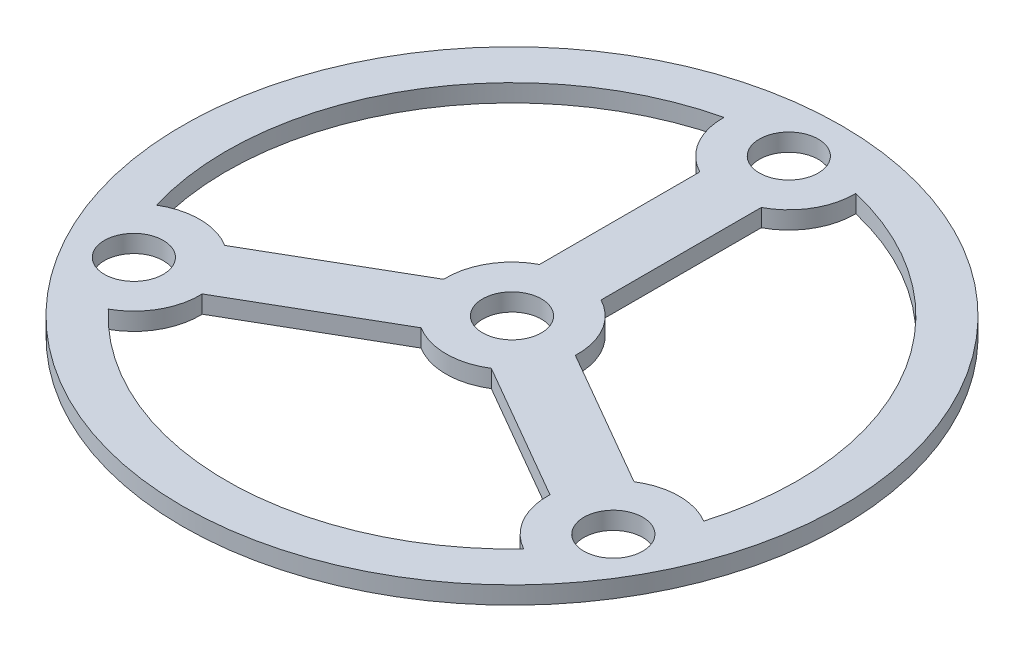
ISO-10303-21;
HEADER;
FILE_DESCRIPTION(('STEP AP214'),'2;1');
FILE_NAME('part.step','',(''),(''),'','','');
FILE_SCHEMA(('AUTOMOTIVE_DESIGN { 1 0 10303 214 1 1 1 1 }'));
ENDSEC;
DATA;
#1=APPLICATION_CONTEXT('core data for automotive mechanical design processes');
#2=APPLICATION_PROTOCOL_DEFINITION('international standard','automotive_design',2000,#1);
#3=PRODUCT_CONTEXT('',#1,'mechanical');
#4=PRODUCT('Part','Part','',(#3));
#5=PRODUCT_RELATED_PRODUCT_CATEGORY('part','',(#4));
#6=PRODUCT_DEFINITION_FORMATION('','',#4);
#7=PRODUCT_DEFINITION_CONTEXT('part definition',#1,'design');
#8=PRODUCT_DEFINITION('design','',#6,#7);
#9=PRODUCT_DEFINITION_SHAPE('','',#8);
#10=(LENGTH_UNIT() NAMED_UNIT(*) SI_UNIT(.MILLI.,.METRE.));
#11=(NAMED_UNIT(*) PLANE_ANGLE_UNIT() SI_UNIT($,.RADIAN.));
#12=(NAMED_UNIT(*) SI_UNIT($,.STERADIAN.) SOLID_ANGLE_UNIT());
#13=UNCERTAINTY_MEASURE_WITH_UNIT(LENGTH_MEASURE(1.E-05),#10,'distance_accuracy_value','');
#14=(GEOMETRIC_REPRESENTATION_CONTEXT(3) GLOBAL_UNCERTAINTY_ASSIGNED_CONTEXT((#13)) GLOBAL_UNIT_ASSIGNED_CONTEXT((#10,
#11,#12)) REPRESENTATION_CONTEXT('',''));
#15=CARTESIAN_POINT('',(0.,0.,0.));
#16=DIRECTION('',(0.,0.,1.));
#17=DIRECTION('',(1.,0.,0.));
#18=AXIS2_PLACEMENT_3D('',#15,#16,#17);
#19=CARTESIAN_POINT('',(0.,2.,-31.5));
#20=DIRECTION('',(0.,-1.,0.));
#21=DIRECTION('',(0.,0.,-1.));
#22=AXIS2_PLACEMENT_3D('',#19,#20,#21);
#23=CYLINDRICAL_SURFACE('',#22,7.50000000000002);
#24=CARTESIAN_POINT('',(0.,2.,-31.5));
#25=DIRECTION('',(0.,-1.,0.));
#26=DIRECTION('',(0.,0.,1.));
#27=AXIS2_PLACEMENT_3D('',#24,#25,#26);
#28=CIRCLE('',#27,7.50000000000002);
#29=CARTESIAN_POINT('',(7.49899107180287,2.,-31.623015873016));
#30=VERTEX_POINT('',#29);
#31=CARTESIAN_POINT('',(3.49999999999925,2.,-24.8667504192888));
#32=VERTEX_POINT('',#31);
#33=EDGE_CURVE('E251',#30,#32,#28,.T.);
#34=ORIENTED_EDGE('',*,*,#33,.T.);
#35=DIRECTION('',(0.,-1.,0.));
#36=VECTOR('',#35,1.);
#37=CARTESIAN_POINT('',(3.49999999999925,2.,-24.8667504192888));
#38=LINE('',#37,#36);
#39=CARTESIAN_POINT('',(3.49999999999925,0.,-24.8667504192888));
#40=VERTEX_POINT('',#39);
#41=EDGE_CURVE('E11',#32,#40,#38,.T.);
#42=ORIENTED_EDGE('',*,*,#41,.T.);
#43=CARTESIAN_POINT('',(0.,0.,-31.5));
#44=DIRECTION('',(0.,-1.,0.));
#45=DIRECTION('',(0.,0.,1.));
#46=AXIS2_PLACEMENT_3D('',#43,#44,#45);
#47=CIRCLE('',#46,7.50000000000002);
#48=CARTESIAN_POINT('',(7.49899107180287,0.,-31.623015873016));
#49=VERTEX_POINT('',#48);
#50=EDGE_CURVE('E269',#49,#40,#47,.T.);
#51=ORIENTED_EDGE('',*,*,#50,.F.);
#52=DIRECTION('',(0.,-1.,0.));
#53=VECTOR('',#52,1.);
#54=CARTESIAN_POINT('',(7.49899107180287,2.,-31.623015873016));
#55=LINE('',#54,#53);
#56=EDGE_CURVE('E268',#30,#49,#55,.T.);
#57=ORIENTED_EDGE('',*,*,#56,.F.);
#58=EDGE_LOOP('',(#34,#42,#51,#57));
#59=FACE_BOUND('',#58,.T.);
#60=ADVANCED_FACE('F35',(#59),#23,.T.);
#61=CARTESIAN_POINT('',(-27.2798002192094,2.,15.7500000000008));
#62=DIRECTION('',(0.,-1.,0.));
#63=DIRECTION('',(0.,0.,-1.));
#64=AXIS2_PLACEMENT_3D('',#61,#62,#63);
#65=CYLINDRICAL_SURFACE('',#64,7.50000000000002);
#66=CARTESIAN_POINT('',(-27.2798002192094,2.,15.7500000000008));
#67=DIRECTION('',(0.,-1.,0.));
#68=DIRECTION('',(0.,0.,1.));
#69=AXIS2_PLACEMENT_3D('',#66,#67,#68);
#70=CIRCLE('',#69,7.50000000000002);
#71=CARTESIAN_POINT('',(-31.1358306262119,2.,9.31719116557405));
#72=VERTEX_POINT('',#71);
#73=CARTESIAN_POINT('',(-23.2852375726713,2.,9.4022862963998));
#74=VERTEX_POINT('',#73);
#75=EDGE_CURVE('E258',#72,#74,#70,.T.);
#76=ORIENTED_EDGE('',*,*,#75,.T.);
#77=DIRECTION('',(0.,-1.,0.));
#78=VECTOR('',#77,1.);
#79=CARTESIAN_POINT('',(-23.2852375726713,2.,9.4022862963998));
#80=LINE('',#79,#78);
#81=CARTESIAN_POINT('',(-23.2852375726713,0.,9.4022862963998));
#82=VERTEX_POINT('',#81);
#83=EDGE_CURVE('E317',#74,#82,#80,.T.);
#84=ORIENTED_EDGE('',*,*,#83,.T.);
#85=CARTESIAN_POINT('',(-27.2798002192094,0.,15.7500000000008));
#86=DIRECTION('',(0.,-1.,0.));
#87=DIRECTION('',(0.,0.,1.));
#88=AXIS2_PLACEMENT_3D('',#85,#86,#87);
#89=CIRCLE('',#88,7.50000000000002);
#90=CARTESIAN_POINT('',(-31.1358306262119,0.,9.31719116557405));
#91=VERTEX_POINT('',#90);
#92=EDGE_CURVE('E276',#91,#82,#89,.T.);
#93=ORIENTED_EDGE('',*,*,#92,.F.);
#94=DIRECTION('',(0.,-1.,0.));
#95=VECTOR('',#94,1.);
#96=CARTESIAN_POINT('',(-31.1358306262119,2.,9.31719116557405));
#97=LINE('',#96,#95);
#98=EDGE_CURVE('E299',#72,#91,#97,.T.);
#99=ORIENTED_EDGE('',*,*,#98,.F.);
#100=EDGE_LOOP('',(#76,#84,#93,#99));
#101=FACE_BOUND('',#100,.T.);
#102=ADVANCED_FACE('F338',(#101),#65,.T.);
#103=CARTESIAN_POINT('',(27.2798002192103,2.,15.7499999999993));
#104=DIRECTION('',(0.,-1.,0.));
#105=DIRECTION('',(0.,0.,-1.));
#106=AXIS2_PLACEMENT_3D('',#103,#104,#105);
#107=CYLINDRICAL_SURFACE('',#106,7.49999999999999);
#108=CARTESIAN_POINT('',(27.2798002192103,2.,15.7499999999993));
#109=DIRECTION('',(0.,-1.,0.));
#110=DIRECTION('',(0.,0.,1.));
#111=AXIS2_PLACEMENT_3D('',#108,#109,#110);
#112=CIRCLE('',#111,7.49999999999999);
#113=CARTESIAN_POINT('',(23.636839554409,2.,22.305824707442));
#114=VERTEX_POINT('',#113);
#115=CARTESIAN_POINT('',(19.7852375726722,2.,15.4644641228897));
#116=VERTEX_POINT('',#115);
#117=EDGE_CURVE('E263',#114,#116,#112,.T.);
#118=ORIENTED_EDGE('',*,*,#117,.T.);
#119=DIRECTION('',(0.,-1.,0.));
#120=VECTOR('',#119,1.);
#121=CARTESIAN_POINT('',(19.7852375726722,2.,15.4644641228897));
#122=LINE('',#121,#120);
#123=CARTESIAN_POINT('',(19.7852375726722,0.,15.4644641228897));
#124=VERTEX_POINT('',#123);
#125=EDGE_CURVE('E308',#116,#124,#122,.T.);
#126=ORIENTED_EDGE('',*,*,#125,.T.);
#127=CARTESIAN_POINT('',(27.2798002192103,0.,15.7499999999993));
#128=DIRECTION('',(0.,-1.,0.));
#129=DIRECTION('',(0.,0.,1.));
#130=AXIS2_PLACEMENT_3D('',#127,#128,#129);
#131=CIRCLE('',#130,7.49999999999999);
#132=CARTESIAN_POINT('',(23.636839554409,0.,22.305824707442));
#133=VERTEX_POINT('',#132);
#134=EDGE_CURVE('E283',#133,#124,#131,.T.);
#135=ORIENTED_EDGE('',*,*,#134,.F.);
#136=DIRECTION('',(0.,-1.,0.));
#137=VECTOR('',#136,1.);
#138=CARTESIAN_POINT('',(23.636839554409,2.,22.305824707442));
#139=LINE('',#138,#137);
#140=EDGE_CURVE('E294',#114,#133,#139,.T.);
#141=ORIENTED_EDGE('',*,*,#140,.F.);
#142=EDGE_LOOP('',(#118,#126,#135,#141));
#143=FACE_BOUND('',#142,.T.);
#144=ADVANCED_FACE('F360',(#143),#107,.T.);
#145=CARTESIAN_POINT('',(0.,2.,0.));
#146=DIRECTION('',(0.,1.,0.));
#147=DIRECTION('',(0.,0.,1.));
#148=AXIS2_PLACEMENT_3D('',#145,#146,#147);
#149=PLANE('',#148);
#150=CARTESIAN_POINT('',(27.2798002192103,2.,15.7499999999993));
#151=DIRECTION('',(0.,1.,0.));
#152=DIRECTION('',(0.,0.,1.));
#153=AXIS2_PLACEMENT_3D('',#150,#151,#152);
#154=CIRCLE('',#153,3.35000000000095);
#155=CARTESIAN_POINT('',(27.2798002192103,2.,19.1000000000002));
#156=VERTEX_POINT('',#155);
#157=EDGE_CURVE('E239',#156,#156,#154,.T.);
#158=ORIENTED_EDGE('',*,*,#157,.F.);
#159=EDGE_LOOP('',(#158));
#160=FACE_BOUND('',#159,.T.);
#161=CARTESIAN_POINT('',(23.285237572672,2.,9.40228629639847));
#162=VERTEX_POINT('',#161);
#163=CARTESIAN_POINT('',(31.1358306262122,2.,9.31719116557278));
#164=VERTEX_POINT('',#163);
#165=EDGE_CURVE('E189',#162,#164,#112,.T.);
#166=ORIENTED_EDGE('',*,*,#165,.F.);
#167=DIRECTION('',(0.866025403784434,0.,0.500000000000008));
#168=VECTOR('',#167,1.);
#169=CARTESIAN_POINT('',(1.75000000000046,2.,-3.03108891324628));
#170=LINE('',#169,#168);
#171=CARTESIAN_POINT('',(7.49456264653806,2.,0.285535877108947));
#172=VERTEX_POINT('',#171);
#173=EDGE_CURVE('E166',#172,#162,#170,.T.);
#174=ORIENTED_EDGE('',*,*,#173,.F.);
#175=CARTESIAN_POINT('',(0.,2.,0.));
#176=DIRECTION('',(0.,1.,0.));
#177=DIRECTION('',(0.,0.,1.));
#178=AXIS2_PLACEMENT_3D('',#175,#176,#177);
#179=CIRCLE('',#178,7.5);
#180=CARTESIAN_POINT('',(3.49999999999916,2.,-6.63324958071124));
#181=VERTEX_POINT('',#180);
#182=EDGE_CURVE('E175',#172,#181,#179,.T.);
#183=ORIENTED_EDGE('',*,*,#182,.T.);
#184=DIRECTION('',(0.,0.,-1.));
#185=VECTOR('',#184,1.);
#186=CARTESIAN_POINT('',(3.49999999999913,2.,0.));
#187=LINE('',#186,#185);
#188=EDGE_CURVE('E181',#181,#32,#187,.T.);
#189=ORIENTED_EDGE('',*,*,#188,.T.);
#190=ORIENTED_EDGE('',*,*,#33,.F.);
#191=CARTESIAN_POINT('',(0.,2.,0.));
#192=DIRECTION('',(0.,1.,0.));
#193=DIRECTION('',(0.,0.,1.));
#194=AXIS2_PLACEMENT_3D('',#191,#192,#193);
#195=CIRCLE('',#194,32.5000000000001);
#196=EDGE_CURVE('E266',#164,#30,#195,.T.);
#197=ORIENTED_EDGE('',*,*,#196,.F.);
#198=EDGE_LOOP('',(#166,#174,#183,#189,#190,#197));
#199=FACE_BOUND('',#198,.T.);
#200=CARTESIAN_POINT('',(0.,2.,-31.5));
#201=DIRECTION('',(0.,1.,0.));
#202=DIRECTION('',(0.,0.,1.));
#203=AXIS2_PLACEMENT_3D('',#200,#201,#202);
#204=CIRCLE('',#203,3.35);
#205=CARTESIAN_POINT('',(0.,2.,-28.15));
#206=VERTEX_POINT('',#205);
#207=EDGE_CURVE('E245',#206,#206,#204,.T.);
#208=ORIENTED_EDGE('',*,*,#207,.F.);
#209=EDGE_LOOP('',(#208));
#210=FACE_BOUND('',#209,.T.);
#211=CARTESIAN_POINT('',(-3.50000000000076,2.,-24.8667504192896));
#212=VERTEX_POINT('',#211);
#213=CARTESIAN_POINT('',(-7.49899107180383,2.,-31.6230158730158));
#214=VERTEX_POINT('',#213);
#215=EDGE_CURVE('E255',#212,#214,#28,.T.);
#216=ORIENTED_EDGE('',*,*,#215,.F.);
#217=DIRECTION('',(0.,0.,-1.));
#218=VECTOR('',#217,1.);
#219=CARTESIAN_POINT('',(-3.50000000000087,2.,0.));
#220=LINE('',#219,#218);
#221=CARTESIAN_POINT('',(-3.50000000000084,2.,-6.63324958071036));
#222=VERTEX_POINT('',#221);
#223=EDGE_CURVE('E197',#222,#212,#220,.T.);
#224=ORIENTED_EDGE('',*,*,#223,.F.);
#225=CARTESIAN_POINT('',(-7.49456264653799,2.,0.285535877110846));
#226=VERTEX_POINT('',#225);
#227=EDGE_CURVE('E184',#222,#226,#179,.T.);
#228=ORIENTED_EDGE('',*,*,#227,.T.);
#229=DIRECTION('',(-0.866025403784439,0.,0.5));
#230=VECTOR('',#229,1.);
#231=CARTESIAN_POINT('',(-1.74999999999957,2.,-3.03108891324478));
#232=LINE('',#231,#230);
#233=EDGE_CURVE('E199',#226,#74,#232,.T.);
#234=ORIENTED_EDGE('',*,*,#233,.T.);
#235=ORIENTED_EDGE('',*,*,#75,.F.);
#236=CARTESIAN_POINT('',(0.,2.,0.));
#237=DIRECTION('',(0.,1.,0.));
#238=DIRECTION('',(0.,0.,1.));
#239=AXIS2_PLACEMENT_3D('',#236,#237,#238);
#240=CIRCLE('',#239,32.5000000000001);
#241=EDGE_CURVE('E254',#214,#72,#240,.T.);
#242=ORIENTED_EDGE('',*,*,#241,.F.);
#243=EDGE_LOOP('',(#216,#224,#228,#234,#235,#242));
#244=FACE_BOUND('',#243,.T.);
#245=CARTESIAN_POINT('',(-27.2798002192094,2.,15.7500000000008));
#246=DIRECTION('',(0.,1.,0.));
#247=DIRECTION('',(0.,0.,1.));
#248=AXIS2_PLACEMENT_3D('',#245,#246,#247);
#249=CIRCLE('',#248,3.35000000000111);
#250=CARTESIAN_POINT('',(-27.2798002192094,2.,19.1000000000019));
#251=VERTEX_POINT('',#250);
#252=EDGE_CURVE('E233',#251,#251,#249,.T.);
#253=ORIENTED_EDGE('',*,*,#252,.F.);
#254=EDGE_LOOP('',(#253));
#255=FACE_BOUND('',#254,.T.);
#256=CARTESIAN_POINT('',(-19.7852375726713,2.,15.4644641228909));
#257=VERTEX_POINT('',#256);
#258=CARTESIAN_POINT('',(-23.6368395544081,2.,22.3058247074431));
#259=VERTEX_POINT('',#258);
#260=EDGE_CURVE('E257',#257,#259,#70,.T.);
#261=ORIENTED_EDGE('',*,*,#260,.F.);
#262=DIRECTION('',(-0.866025403784439,0.,0.5));
#263=VECTOR('',#262,1.);
#264=CARTESIAN_POINT('',(1.75000000000044,2.,3.03108891324629));
#265=LINE('',#264,#263);
#266=CARTESIAN_POINT('',(-3.99456264653719,2.,6.34771370360146));
#267=VERTEX_POINT('',#266);
#268=EDGE_CURVE('E202',#267,#257,#265,.T.);
#269=ORIENTED_EDGE('',*,*,#268,.F.);
#270=CARTESIAN_POINT('',(3.9945626465388,2.,6.34771370360045));
#271=VERTEX_POINT('',#270);
#272=EDGE_CURVE('E183',#267,#271,#179,.T.);
#273=ORIENTED_EDGE('',*,*,#272,.T.);
#274=DIRECTION('',(0.866025403784434,0.,0.500000000000008));
#275=VECTOR('',#274,1.);
#276=CARTESIAN_POINT('',(-1.74999999999959,2.,3.03108891324476));
#277=LINE('',#276,#275);
#278=EDGE_CURVE('E204',#271,#116,#277,.T.);
#279=ORIENTED_EDGE('',*,*,#278,.T.);
#280=ORIENTED_EDGE('',*,*,#117,.F.);
#281=CARTESIAN_POINT('',(0.,2.,0.));
#282=DIRECTION('',(0.,1.,0.));
#283=DIRECTION('',(0.,0.,1.));
#284=AXIS2_PLACEMENT_3D('',#281,#282,#283);
#285=CIRCLE('',#284,32.5000000000001);
#286=EDGE_CURVE('E261',#259,#114,#285,.T.);
#287=ORIENTED_EDGE('',*,*,#286,.F.);
#288=EDGE_LOOP('',(#261,#269,#273,#279,#280,#287));
#289=FACE_BOUND('',#288,.T.);
#290=CARTESIAN_POINT('',(0.,2.,0.));
#291=DIRECTION('',(0.,1.,0.));
#292=DIRECTION('',(0.,0.,1.));
#293=AXIS2_PLACEMENT_3D('',#290,#291,#292);
#294=CIRCLE('',#293,3.35);
#295=CARTESIAN_POINT('',(0.,2.,3.35));
#296=VERTEX_POINT('',#295);
#297=EDGE_CURVE('E207',#296,#296,#294,.T.);
#298=ORIENTED_EDGE('',*,*,#297,.F.);
#299=EDGE_LOOP('',(#298));
#300=FACE_BOUND('',#299,.T.);
#301=CARTESIAN_POINT('',(0.,2.,0.));
#302=DIRECTION('',(0.,1.,0.));
#303=DIRECTION('',(0.,0.,1.));
#304=AXIS2_PLACEMENT_3D('',#301,#302,#303);
#305=CIRCLE('',#304,37.5);
#306=CARTESIAN_POINT('',(0.,2.,37.5));
#307=VERTEX_POINT('',#306);
#308=EDGE_CURVE('E305',#307,#307,#305,.T.);
#309=ORIENTED_EDGE('',*,*,#308,.T.);
#310=EDGE_LOOP('',(#309));
#311=FACE_BOUND('',#310,.T.);
#312=ADVANCED_FACE('F186',(#160,#199,#210,#244,#255,#289,#300,#311),#149,.T.);
#313=CARTESIAN_POINT('',(0.,0.,0.));
#314=DIRECTION('',(0.,1.,0.));
#315=DIRECTION('',(0.,0.,1.));
#316=AXIS2_PLACEMENT_3D('',#313,#314,#315);
#317=PLANE('',#316);
#318=CARTESIAN_POINT('',(27.2798002192103,0.,15.7499999999993));
#319=DIRECTION('',(0.,1.,0.));
#320=DIRECTION('',(0.,0.,1.));
#321=AXIS2_PLACEMENT_3D('',#318,#319,#320);
#322=CIRCLE('',#321,3.35000000000095);
#323=CARTESIAN_POINT('',(27.2798002192103,0.,19.1000000000002));
#324=VERTEX_POINT('',#323);
#325=EDGE_CURVE('E236',#324,#324,#322,.T.);
#326=ORIENTED_EDGE('',*,*,#325,.T.);
#327=EDGE_LOOP('',(#326));
#328=FACE_BOUND('',#327,.T.);
#329=DIRECTION('',(0.866025403784434,0.,0.500000000000008));
#330=VECTOR('',#329,1.);
#331=CARTESIAN_POINT('',(1.75000000000046,0.,-3.03108891324628));
#332=LINE('',#331,#330);
#333=CARTESIAN_POINT('',(7.49456264653806,0.,0.285535877108947));
#334=VERTEX_POINT('',#333);
#335=CARTESIAN_POINT('',(23.285237572672,0.,9.40228629639847));
#336=VERTEX_POINT('',#335);
#337=EDGE_CURVE('E168',#334,#336,#332,.T.);
#338=ORIENTED_EDGE('',*,*,#337,.T.);
#339=CARTESIAN_POINT('',(31.1358306262123,0.,9.3171911655728));
#340=VERTEX_POINT('',#339);
#341=EDGE_CURVE('E282',#336,#340,#131,.T.);
#342=ORIENTED_EDGE('',*,*,#341,.T.);
#343=CARTESIAN_POINT('',(0.,0.,0.));
#344=DIRECTION('',(0.,1.,0.));
#345=DIRECTION('',(0.,0.,1.));
#346=AXIS2_PLACEMENT_3D('',#343,#344,#345);
#347=CIRCLE('',#346,32.5000000000001);
#348=EDGE_CURVE('E286',#340,#49,#347,.T.);
#349=ORIENTED_EDGE('',*,*,#348,.T.);
#350=ORIENTED_EDGE('',*,*,#50,.T.);
#351=DIRECTION('',(0.,0.,-1.));
#352=VECTOR('',#351,1.);
#353=CARTESIAN_POINT('',(3.49999999999913,0.,0.));
#354=LINE('',#353,#352);
#355=CARTESIAN_POINT('',(3.49999999999916,0.,-6.63324958071124));
#356=VERTEX_POINT('',#355);
#357=EDGE_CURVE('E214',#356,#40,#354,.T.);
#358=ORIENTED_EDGE('',*,*,#357,.F.);
#359=CARTESIAN_POINT('',(0.,0.,0.));
#360=DIRECTION('',(0.,1.,0.));
#361=DIRECTION('',(0.,0.,1.));
#362=AXIS2_PLACEMENT_3D('',#359,#360,#361);
#363=CIRCLE('',#362,7.5);
#364=EDGE_CURVE('E212',#334,#356,#363,.T.);
#365=ORIENTED_EDGE('',*,*,#364,.F.);
#366=EDGE_LOOP('',(#338,#342,#349,#350,#358,#365));
#367=FACE_BOUND('',#366,.T.);
#368=CARTESIAN_POINT('',(0.,0.,-31.5));
#369=DIRECTION('',(0.,1.,0.));
#370=DIRECTION('',(0.,0.,1.));
#371=AXIS2_PLACEMENT_3D('',#368,#369,#370);
#372=CIRCLE('',#371,3.35);
#373=CARTESIAN_POINT('',(0.,0.,-28.15));
#374=VERTEX_POINT('',#373);
#375=EDGE_CURVE('E242',#374,#374,#372,.T.);
#376=ORIENTED_EDGE('',*,*,#375,.T.);
#377=EDGE_LOOP('',(#376));
#378=FACE_BOUND('',#377,.T.);
#379=DIRECTION('',(0.,0.,-1.));
#380=VECTOR('',#379,1.);
#381=CARTESIAN_POINT('',(-3.50000000000087,0.,0.));
#382=LINE('',#381,#380);
#383=CARTESIAN_POINT('',(-3.50000000000084,0.,-6.63324958071036));
#384=VERTEX_POINT('',#383);
#385=CARTESIAN_POINT('',(-3.50000000000076,0.,-24.8667504192896));
#386=VERTEX_POINT('',#385);
#387=EDGE_CURVE('E50',#384,#386,#382,.T.);
#388=ORIENTED_EDGE('',*,*,#387,.T.);
#389=CARTESIAN_POINT('',(-7.49899107180383,0.,-31.6230158730158));
#390=VERTEX_POINT('',#389);
#391=EDGE_CURVE('E248',#386,#390,#47,.T.);
#392=ORIENTED_EDGE('',*,*,#391,.T.);
#393=CARTESIAN_POINT('',(0.,0.,0.));
#394=DIRECTION('',(0.,1.,0.));
#395=DIRECTION('',(0.,0.,1.));
#396=AXIS2_PLACEMENT_3D('',#393,#394,#395);
#397=CIRCLE('',#396,32.5000000000001);
#398=EDGE_CURVE('E272',#390,#91,#397,.T.);
#399=ORIENTED_EDGE('',*,*,#398,.T.);
#400=ORIENTED_EDGE('',*,*,#92,.T.);
#401=DIRECTION('',(-0.866025403784439,0.,0.5));
#402=VECTOR('',#401,1.);
#403=CARTESIAN_POINT('',(-1.74999999999957,0.,-3.03108891324478));
#404=LINE('',#403,#402);
#405=CARTESIAN_POINT('',(-7.49456264653799,0.,0.285535877110846));
#406=VERTEX_POINT('',#405);
#407=EDGE_CURVE('E219',#406,#82,#404,.T.);
#408=ORIENTED_EDGE('',*,*,#407,.F.);
#409=EDGE_CURVE('E216',#384,#406,#363,.T.);
#410=ORIENTED_EDGE('',*,*,#409,.F.);
#411=EDGE_LOOP('',(#388,#392,#399,#400,#408,#410));
#412=FACE_BOUND('',#411,.T.);
#413=CARTESIAN_POINT('',(-27.2798002192094,0.,15.7500000000008));
#414=DIRECTION('',(0.,1.,0.));
#415=DIRECTION('',(0.,0.,1.));
#416=AXIS2_PLACEMENT_3D('',#413,#414,#415);
#417=CIRCLE('',#416,3.35000000000111);
#418=CARTESIAN_POINT('',(-27.2798002192094,0.,19.1000000000019));
#419=VERTEX_POINT('',#418);
#420=EDGE_CURVE('E171',#419,#419,#417,.T.);
#421=ORIENTED_EDGE('',*,*,#420,.T.);
#422=EDGE_LOOP('',(#421));
#423=FACE_BOUND('',#422,.T.);
#424=DIRECTION('',(-0.866025403784439,0.,0.5));
#425=VECTOR('',#424,1.);
#426=CARTESIAN_POINT('',(1.75000000000044,0.,3.03108891324629));
#427=LINE('',#426,#425);
#428=CARTESIAN_POINT('',(-3.99456264653719,0.,6.34771370360146));
#429=VERTEX_POINT('',#428);
#430=CARTESIAN_POINT('',(-19.7852375726713,0.,15.4644641228909));
#431=VERTEX_POINT('',#430);
#432=EDGE_CURVE('E58',#429,#431,#427,.T.);
#433=ORIENTED_EDGE('',*,*,#432,.T.);
#434=CARTESIAN_POINT('',(-23.6368395544081,0.,22.3058247074431));
#435=VERTEX_POINT('',#434);
#436=EDGE_CURVE('E275',#431,#435,#89,.T.);
#437=ORIENTED_EDGE('',*,*,#436,.T.);
#438=CARTESIAN_POINT('',(0.,0.,0.));
#439=DIRECTION('',(0.,1.,0.));
#440=DIRECTION('',(0.,0.,1.));
#441=AXIS2_PLACEMENT_3D('',#438,#439,#440);
#442=CIRCLE('',#441,32.5000000000001);
#443=EDGE_CURVE('E279',#435,#133,#442,.T.);
#444=ORIENTED_EDGE('',*,*,#443,.T.);
#445=ORIENTED_EDGE('',*,*,#134,.T.);
#446=DIRECTION('',(0.866025403784434,0.,0.500000000000008));
#447=VECTOR('',#446,1.);
#448=CARTESIAN_POINT('',(-1.74999999999959,0.,3.03108891324476));
#449=LINE('',#448,#447);
#450=CARTESIAN_POINT('',(3.9945626465388,0.,6.34771370360045));
#451=VERTEX_POINT('',#450);
#452=EDGE_CURVE('E193',#451,#124,#449,.T.);
#453=ORIENTED_EDGE('',*,*,#452,.F.);
#454=EDGE_CURVE('E215',#429,#451,#363,.T.);
#455=ORIENTED_EDGE('',*,*,#454,.F.);
#456=EDGE_LOOP('',(#433,#437,#444,#445,#453,#455));
#457=FACE_BOUND('',#456,.T.);
#458=CARTESIAN_POINT('',(0.,0.,0.));
#459=DIRECTION('',(0.,1.,0.));
#460=DIRECTION('',(0.,0.,1.));
#461=AXIS2_PLACEMENT_3D('',#458,#459,#460);
#462=CIRCLE('',#461,3.35);
#463=CARTESIAN_POINT('',(0.,0.,3.35));
#464=VERTEX_POINT('',#463);
#465=EDGE_CURVE('E190',#464,#464,#462,.T.);
#466=ORIENTED_EDGE('',*,*,#465,.T.);
#467=EDGE_LOOP('',(#466));
#468=FACE_BOUND('',#467,.T.);
#469=CARTESIAN_POINT('',(0.,0.,0.));
#470=DIRECTION('',(0.,1.,0.));
#471=DIRECTION('',(0.,0.,1.));
#472=AXIS2_PLACEMENT_3D('',#469,#470,#471);
#473=CIRCLE('',#472,37.5);
#474=CARTESIAN_POINT('',(0.,0.,37.5));
#475=VERTEX_POINT('',#474);
#476=EDGE_CURVE('E304',#475,#475,#473,.T.);
#477=ORIENTED_EDGE('',*,*,#476,.F.);
#478=EDGE_LOOP('',(#477));
#479=FACE_BOUND('',#478,.T.);
#480=ADVANCED_FACE('F329',(#328,#367,#378,#412,#423,#457,#468,#479),#317,.F.);
#481=CARTESIAN_POINT('',(0.,2.,0.));
#482=DIRECTION('',(0.,-1.,0.));
#483=DIRECTION('',(0.,0.,-1.));
#484=AXIS2_PLACEMENT_3D('',#481,#482,#483);
#485=CYLINDRICAL_SURFACE('',#484,37.5);
#486=ORIENTED_EDGE('',*,*,#308,.F.);
#487=EDGE_LOOP('',(#486));
#488=FACE_BOUND('',#487,.T.);
#489=ORIENTED_EDGE('',*,*,#476,.T.);
#490=EDGE_LOOP('',(#489));
#491=FACE_BOUND('',#490,.T.);
#492=ADVANCED_FACE('F37',(#488,#491),#485,.T.);
#493=DIRECTION('',(0.,-1.,0.));
#494=VECTOR('',#493,1.);
#495=CARTESIAN_POINT('',(-3.50000000000076,2.,-24.8667504192896));
#496=LINE('',#495,#494);
#497=EDGE_CURVE('E43',#212,#386,#496,.T.);
#498=ORIENTED_EDGE('',*,*,#497,.F.);
#499=ORIENTED_EDGE('',*,*,#215,.T.);
#500=DIRECTION('',(0.,-1.,0.));
#501=VECTOR('',#500,1.);
#502=CARTESIAN_POINT('',(-7.49899107180383,2.,-31.6230158730158));
#503=LINE('',#502,#501);
#504=EDGE_CURVE('E301',#214,#390,#503,.T.);
#505=ORIENTED_EDGE('',*,*,#504,.T.);
#506=ORIENTED_EDGE('',*,*,#391,.F.);
#507=EDGE_LOOP('',(#498,#499,#505,#506));
#508=FACE_BOUND('',#507,.T.);
#509=ADVANCED_FACE('F326',(#508),#23,.T.);
#510=CARTESIAN_POINT('',(0.,2.,0.));
#511=DIRECTION('',(0.,-1.,0.));
#512=DIRECTION('',(0.,0.,-1.));
#513=AXIS2_PLACEMENT_3D('',#510,#511,#512);
#514=CYLINDRICAL_SURFACE('',#513,32.5000000000001);
#515=ORIENTED_EDGE('',*,*,#398,.F.);
#516=ORIENTED_EDGE('',*,*,#504,.F.);
#517=ORIENTED_EDGE('',*,*,#241,.T.);
#518=ORIENTED_EDGE('',*,*,#98,.T.);
#519=EDGE_LOOP('',(#515,#516,#517,#518));
#520=FACE_BOUND('',#519,.T.);
#521=ADVANCED_FACE('F332',(#520),#514,.F.);
#522=DIRECTION('',(0.,-1.,0.));
#523=VECTOR('',#522,1.);
#524=CARTESIAN_POINT('',(-19.7852375726713,2.,15.4644641228909));
#525=LINE('',#524,#523);
#526=EDGE_CURVE('E315',#257,#431,#525,.T.);
#527=ORIENTED_EDGE('',*,*,#526,.F.);
#528=ORIENTED_EDGE('',*,*,#260,.T.);
#529=DIRECTION('',(0.,-1.,0.));
#530=VECTOR('',#529,1.);
#531=CARTESIAN_POINT('',(-23.6368395544081,2.,22.3058247074431));
#532=LINE('',#531,#530);
#533=EDGE_CURVE('E296',#259,#435,#532,.T.);
#534=ORIENTED_EDGE('',*,*,#533,.T.);
#535=ORIENTED_EDGE('',*,*,#436,.F.);
#536=EDGE_LOOP('',(#527,#528,#534,#535));
#537=FACE_BOUND('',#536,.T.);
#538=ADVANCED_FACE('F394',(#537),#65,.T.);
#539=CARTESIAN_POINT('',(0.,2.,0.));
#540=DIRECTION('',(0.,-1.,0.));
#541=DIRECTION('',(0.,0.,-1.));
#542=AXIS2_PLACEMENT_3D('',#539,#540,#541);
#543=CYLINDRICAL_SURFACE('',#542,32.5000000000001);
#544=ORIENTED_EDGE('',*,*,#443,.F.);
#545=ORIENTED_EDGE('',*,*,#533,.F.);
#546=ORIENTED_EDGE('',*,*,#286,.T.);
#547=ORIENTED_EDGE('',*,*,#140,.T.);
#548=EDGE_LOOP('',(#544,#545,#546,#547));
#549=FACE_BOUND('',#548,.T.);
#550=ADVANCED_FACE('F403',(#549),#543,.F.);
#551=DIRECTION('',(0.,-1.,0.));
#552=VECTOR('',#551,1.);
#553=CARTESIAN_POINT('',(23.285237572672,2.,9.40228629639847));
#554=LINE('',#553,#552);
#555=EDGE_CURVE('E313',#162,#336,#554,.T.);
#556=ORIENTED_EDGE('',*,*,#555,.F.);
#557=ORIENTED_EDGE('',*,*,#165,.T.);
#558=DIRECTION('',(0.,-1.,0.));
#559=VECTOR('',#558,1.);
#560=CARTESIAN_POINT('',(31.1358306262123,2.,9.3171911655728));
#561=LINE('',#560,#559);
#562=EDGE_CURVE('E291',#164,#340,#561,.T.);
#563=ORIENTED_EDGE('',*,*,#562,.T.);
#564=ORIENTED_EDGE('',*,*,#341,.F.);
#565=EDGE_LOOP('',(#556,#557,#563,#564));
#566=FACE_BOUND('',#565,.T.);
#567=ADVANCED_FACE('F408',(#566),#107,.T.);
#568=CARTESIAN_POINT('',(0.,2.,0.));
#569=DIRECTION('',(0.,-1.,0.));
#570=DIRECTION('',(0.,0.,-1.));
#571=AXIS2_PLACEMENT_3D('',#568,#569,#570);
#572=CYLINDRICAL_SURFACE('',#571,32.5000000000001);
#573=ORIENTED_EDGE('',*,*,#348,.F.);
#574=ORIENTED_EDGE('',*,*,#562,.F.);
#575=ORIENTED_EDGE('',*,*,#196,.T.);
#576=ORIENTED_EDGE('',*,*,#56,.T.);
#577=EDGE_LOOP('',(#573,#574,#575,#576));
#578=FACE_BOUND('',#577,.T.);
#579=ADVANCED_FACE('F412',(#578),#572,.F.);
#580=CARTESIAN_POINT('',(0.,2.,-31.5));
#581=DIRECTION('',(0.,-1.,0.));
#582=DIRECTION('',(0.,0.,-1.));
#583=AXIS2_PLACEMENT_3D('',#580,#581,#582);
#584=CYLINDRICAL_SURFACE('',#583,3.35);
#585=ORIENTED_EDGE('',*,*,#207,.T.);
#586=EDGE_LOOP('',(#585));
#587=FACE_BOUND('',#586,.T.);
#588=ORIENTED_EDGE('',*,*,#375,.F.);
#589=EDGE_LOOP('',(#588));
#590=FACE_BOUND('',#589,.T.);
#591=ADVANCED_FACE('F416',(#587,#590),#584,.F.);
#592=CARTESIAN_POINT('',(27.2798002192103,2.,15.7499999999993));
#593=DIRECTION('',(0.,-1.,0.));
#594=DIRECTION('',(0.,0.,-1.));
#595=AXIS2_PLACEMENT_3D('',#592,#593,#594);
#596=CYLINDRICAL_SURFACE('',#595,3.35000000000095);
#597=ORIENTED_EDGE('',*,*,#325,.F.);
#598=EDGE_LOOP('',(#597));
#599=FACE_BOUND('',#598,.T.);
#600=ORIENTED_EDGE('',*,*,#157,.T.);
#601=EDGE_LOOP('',(#600));
#602=FACE_BOUND('',#601,.T.);
#603=ADVANCED_FACE('F377',(#599,#602),#596,.F.);
#604=CARTESIAN_POINT('',(-27.2798002192094,2.,15.7500000000008));
#605=DIRECTION('',(0.,-1.,0.));
#606=DIRECTION('',(0.,0.,-1.));
#607=AXIS2_PLACEMENT_3D('',#604,#605,#606);
#608=CYLINDRICAL_SURFACE('',#607,3.35000000000111);
#609=ORIENTED_EDGE('',*,*,#252,.T.);
#610=EDGE_LOOP('',(#609));
#611=FACE_BOUND('',#610,.T.);
#612=ORIENTED_EDGE('',*,*,#420,.F.);
#613=EDGE_LOOP('',(#612));
#614=FACE_BOUND('',#613,.T.);
#615=ADVANCED_FACE('F374',(#611,#614),#608,.F.);
#616=CARTESIAN_POINT('',(1.75000000000046,2.,-3.03108891324628));
#617=DIRECTION('',(0.500000000000008,0.,-0.866025403784434));
#618=DIRECTION('',(-0.866025403784434,0.,-0.500000000000008));
#619=AXIS2_PLACEMENT_3D('',#616,#617,#618);
#620=PLANE('',#619);
#621=ORIENTED_EDGE('',*,*,#173,.T.);
#622=ORIENTED_EDGE('',*,*,#555,.T.);
#623=ORIENTED_EDGE('',*,*,#337,.F.);
#624=DIRECTION('',(0.,-1.,0.));
#625=VECTOR('',#624,1.);
#626=CARTESIAN_POINT('',(7.49456264653806,2.,0.285535877108947));
#627=LINE('',#626,#625);
#628=EDGE_CURVE('E161',#172,#334,#627,.T.);
#629=ORIENTED_EDGE('',*,*,#628,.F.);
#630=EDGE_LOOP('',(#621,#622,#623,#629));
#631=FACE_BOUND('',#630,.T.);
#632=ADVANCED_FACE('F163',(#631),#620,.T.);
#633=CARTESIAN_POINT('',(0.,2.,0.));
#634=DIRECTION('',(0.,-1.,0.));
#635=DIRECTION('',(0.,0.,-1.));
#636=AXIS2_PLACEMENT_3D('',#633,#634,#635);
#637=CYLINDRICAL_SURFACE('',#636,7.5);
#638=ORIENTED_EDGE('',*,*,#364,.T.);
#639=DIRECTION('',(0.,-1.,0.));
#640=VECTOR('',#639,1.);
#641=CARTESIAN_POINT('',(3.49999999999916,2.,-6.63324958071124));
#642=LINE('',#641,#640);
#643=EDGE_CURVE('E172',#181,#356,#642,.T.);
#644=ORIENTED_EDGE('',*,*,#643,.F.);
#645=ORIENTED_EDGE('',*,*,#182,.F.);
#646=ORIENTED_EDGE('',*,*,#628,.T.);
#647=EDGE_LOOP('',(#638,#644,#645,#646));
#648=FACE_BOUND('',#647,.T.);
#649=ADVANCED_FACE('F176',(#648),#637,.T.);
#650=CARTESIAN_POINT('',(3.49999999999913,2.,0.));
#651=DIRECTION('',(-1.,0.,0.));
#652=DIRECTION('',(0.,0.,1.));
#653=AXIS2_PLACEMENT_3D('',#650,#651,#652);
#654=PLANE('',#653);
#655=ORIENTED_EDGE('',*,*,#41,.F.);
#656=ORIENTED_EDGE('',*,*,#188,.F.);
#657=ORIENTED_EDGE('',*,*,#643,.T.);
#658=ORIENTED_EDGE('',*,*,#357,.T.);
#659=EDGE_LOOP('',(#655,#656,#657,#658));
#660=FACE_BOUND('',#659,.T.);
#661=ADVANCED_FACE('F426',(#660),#654,.F.);
#662=CARTESIAN_POINT('',(-3.50000000000087,2.,0.));
#663=DIRECTION('',(-1.,0.,0.));
#664=DIRECTION('',(0.,0.,1.));
#665=AXIS2_PLACEMENT_3D('',#662,#663,#664);
#666=PLANE('',#665);
#667=ORIENTED_EDGE('',*,*,#223,.T.);
#668=ORIENTED_EDGE('',*,*,#497,.T.);
#669=ORIENTED_EDGE('',*,*,#387,.F.);
#670=DIRECTION('',(0.,-1.,0.));
#671=VECTOR('',#670,1.);
#672=CARTESIAN_POINT('',(-3.50000000000084,2.,-6.63324958071036));
#673=LINE('',#672,#671);
#674=EDGE_CURVE('E230',#222,#384,#673,.T.);
#675=ORIENTED_EDGE('',*,*,#674,.F.);
#676=EDGE_LOOP('',(#667,#668,#669,#675));
#677=FACE_BOUND('',#676,.T.);
#678=ADVANCED_FACE('F322',(#677),#666,.T.);
#679=ORIENTED_EDGE('',*,*,#409,.T.);
#680=DIRECTION('',(0.,-1.,0.));
#681=VECTOR('',#680,1.);
#682=CARTESIAN_POINT('',(-7.49456264653799,2.,0.285535877110846));
#683=LINE('',#682,#681);
#684=EDGE_CURVE('E227',#226,#406,#683,.T.);
#685=ORIENTED_EDGE('',*,*,#684,.F.);
#686=ORIENTED_EDGE('',*,*,#227,.F.);
#687=ORIENTED_EDGE('',*,*,#674,.T.);
#688=EDGE_LOOP('',(#679,#685,#686,#687));
#689=FACE_BOUND('',#688,.T.);
#690=ADVANCED_FACE('F346',(#689),#637,.T.);
#691=CARTESIAN_POINT('',(-1.74999999999957,2.,-3.03108891324478));
#692=DIRECTION('',(0.5,0.,0.866025403784439));
#693=DIRECTION('',(0.866025403784439,0.,-0.5));
#694=AXIS2_PLACEMENT_3D('',#691,#692,#693);
#695=PLANE('',#694);
#696=ORIENTED_EDGE('',*,*,#83,.F.);
#697=ORIENTED_EDGE('',*,*,#233,.F.);
#698=ORIENTED_EDGE('',*,*,#684,.T.);
#699=ORIENTED_EDGE('',*,*,#407,.T.);
#700=EDGE_LOOP('',(#696,#697,#698,#699));
#701=FACE_BOUND('',#700,.T.);
#702=ADVANCED_FACE('F341',(#701),#695,.F.);
#703=CARTESIAN_POINT('',(1.75000000000044,2.,3.03108891324629));
#704=DIRECTION('',(0.5,0.,0.866025403784439));
#705=DIRECTION('',(0.866025403784439,0.,-0.5));
#706=AXIS2_PLACEMENT_3D('',#703,#704,#705);
#707=PLANE('',#706);
#708=ORIENTED_EDGE('',*,*,#268,.T.);
#709=ORIENTED_EDGE('',*,*,#526,.T.);
#710=ORIENTED_EDGE('',*,*,#432,.F.);
#711=DIRECTION('',(0.,-1.,0.));
#712=VECTOR('',#711,1.);
#713=CARTESIAN_POINT('',(-3.99456264653719,2.,6.34771370360146));
#714=LINE('',#713,#712);
#715=EDGE_CURVE('E225',#267,#429,#714,.T.);
#716=ORIENTED_EDGE('',*,*,#715,.F.);
#717=EDGE_LOOP('',(#708,#709,#710,#716));
#718=FACE_BOUND('',#717,.T.);
#719=ADVANCED_FACE('F434',(#718),#707,.T.);
#720=ORIENTED_EDGE('',*,*,#454,.T.);
#721=DIRECTION('',(0.,-1.,0.));
#722=VECTOR('',#721,1.);
#723=CARTESIAN_POINT('',(3.9945626465388,2.,6.34771370360045));
#724=LINE('',#723,#722);
#725=EDGE_CURVE('E210',#271,#451,#724,.T.);
#726=ORIENTED_EDGE('',*,*,#725,.F.);
#727=ORIENTED_EDGE('',*,*,#272,.F.);
#728=ORIENTED_EDGE('',*,*,#715,.T.);
#729=EDGE_LOOP('',(#720,#726,#727,#728));
#730=FACE_BOUND('',#729,.T.);
#731=ADVANCED_FACE('F349',(#730),#637,.T.);
#732=CARTESIAN_POINT('',(-1.74999999999959,2.,3.03108891324476));
#733=DIRECTION('',(0.500000000000008,0.,-0.866025403784434));
#734=DIRECTION('',(-0.866025403784434,0.,-0.500000000000008));
#735=AXIS2_PLACEMENT_3D('',#732,#733,#734);
#736=PLANE('',#735);
#737=ORIENTED_EDGE('',*,*,#125,.F.);
#738=ORIENTED_EDGE('',*,*,#278,.F.);
#739=ORIENTED_EDGE('',*,*,#725,.T.);
#740=ORIENTED_EDGE('',*,*,#452,.T.);
#741=EDGE_LOOP('',(#737,#738,#739,#740));
#742=FACE_BOUND('',#741,.T.);
#743=ADVANCED_FACE('F354',(#742),#736,.F.);
#744=CARTESIAN_POINT('',(0.,2.,0.));
#745=DIRECTION('',(0.,-1.,0.));
#746=DIRECTION('',(0.,0.,-1.));
#747=AXIS2_PLACEMENT_3D('',#744,#745,#746);
#748=CYLINDRICAL_SURFACE('',#747,3.35);
#749=ORIENTED_EDGE('',*,*,#297,.T.);
#750=EDGE_LOOP('',(#749));
#751=FACE_BOUND('',#750,.T.);
#752=ORIENTED_EDGE('',*,*,#465,.F.);
#753=EDGE_LOOP('',(#752));
#754=FACE_BOUND('',#753,.T.);
#755=ADVANCED_FACE('F442',(#751,#754),#748,.F.);
#756=CLOSED_SHELL('',(#60,#102,#144,#312,#480,#492,#509,#521,#538,#550,#567,#579,#591,#603,#615,
#632,#649,#661,#678,#690,#702,#719,#731,#743,#755));
#757=MANIFOLD_SOLID_BREP('B2',#756);
#758=ADVANCED_BREP_SHAPE_REPRESENTATION('',(#18,#757),#14);
#759=SHAPE_DEFINITION_REPRESENTATION(#9,#758);
ENDSEC;
END-ISO-10303-21;
